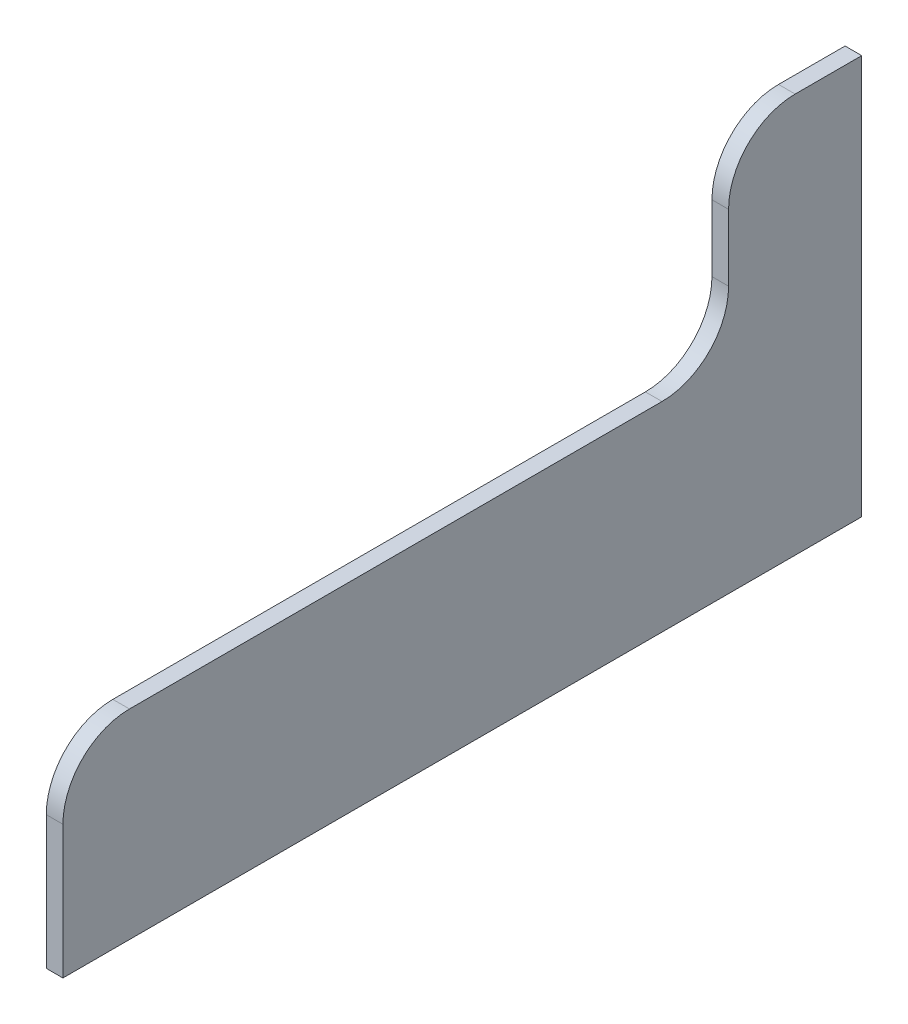
ISO-10303-21;
HEADER;
FILE_DESCRIPTION(('STEP AP214'),'2;1');
FILE_NAME('part.step','',(''),(''),'','','');
FILE_SCHEMA(('AUTOMOTIVE_DESIGN { 1 0 10303 214 1 1 1 1 }'));
ENDSEC;
DATA;
#1=APPLICATION_CONTEXT('core data for automotive mechanical design processes');
#2=APPLICATION_PROTOCOL_DEFINITION('international standard','automotive_design',2000,#1);
#3=PRODUCT_CONTEXT('',#1,'mechanical');
#4=PRODUCT('Part','Part','',(#3));
#5=PRODUCT_RELATED_PRODUCT_CATEGORY('part','',(#4));
#6=PRODUCT_DEFINITION_FORMATION('','',#4);
#7=PRODUCT_DEFINITION_CONTEXT('part definition',#1,'design');
#8=PRODUCT_DEFINITION('design','',#6,#7);
#9=PRODUCT_DEFINITION_SHAPE('','',#8);
#10=(LENGTH_UNIT() NAMED_UNIT(*) SI_UNIT(.MILLI.,.METRE.));
#11=(NAMED_UNIT(*) PLANE_ANGLE_UNIT() SI_UNIT($,.RADIAN.));
#12=(NAMED_UNIT(*) SI_UNIT($,.STERADIAN.) SOLID_ANGLE_UNIT());
#13=UNCERTAINTY_MEASURE_WITH_UNIT(LENGTH_MEASURE(1.E-05),#10,'distance_accuracy_value','');
#14=(GEOMETRIC_REPRESENTATION_CONTEXT(3) GLOBAL_UNCERTAINTY_ASSIGNED_CONTEXT((#13)) GLOBAL_UNIT_ASSIGNED_CONTEXT((#10,
#11,#12)) REPRESENTATION_CONTEXT('',''));
#15=CARTESIAN_POINT('',(0.,0.,0.));
#16=DIRECTION('',(0.,0.,1.));
#17=DIRECTION('',(1.,0.,0.));
#18=AXIS2_PLACEMENT_3D('',#15,#16,#17);
#19=CARTESIAN_POINT('',(12.7,0.,0.));
#20=DIRECTION('',(1.,0.,0.));
#21=DIRECTION('',(0.,0.,-1.));
#22=AXIS2_PLACEMENT_3D('',#19,#20,#21);
#23=PLANE('',#22);
#24=CARTESIAN_POINT('',(12.7,203.2,152.4));
#25=DIRECTION('',(1.,0.,0.));
#26=DIRECTION('',(0.,0.,-1.));
#27=AXIS2_PLACEMENT_3D('',#24,#25,#26);
#28=CIRCLE('',#27,50.8);
#29=CARTESIAN_POINT('',(12.7,203.2,101.6));
#30=VERTEX_POINT('',#29);
#31=CARTESIAN_POINT('',(12.7,152.4,152.4));
#32=VERTEX_POINT('',#31);
#33=EDGE_CURVE('E156',#30,#32,#28,.F.);
#34=ORIENTED_EDGE('',*,*,#33,.T.);
#35=DIRECTION('',(0.,0.,1.));
#36=VECTOR('',#35,1.);
#37=CARTESIAN_POINT('',(12.7,152.4,101.6));
#38=LINE('',#37,#36);
#39=CARTESIAN_POINT('',(12.7,152.4,558.8));
#40=VERTEX_POINT('',#39);
#41=EDGE_CURVE('E153',#40,#32,#38,.F.);
#42=ORIENTED_EDGE('',*,*,#41,.F.);
#43=CARTESIAN_POINT('',(12.7,101.6,558.8));
#44=DIRECTION('',(-1.,0.,0.));
#45=DIRECTION('',(0.,0.,1.));
#46=AXIS2_PLACEMENT_3D('',#43,#44,#45);
#47=CIRCLE('',#46,50.8);
#48=CARTESIAN_POINT('',(12.7,101.6,609.6));
#49=VERTEX_POINT('',#48);
#50=EDGE_CURVE('E179',#49,#40,#47,.T.);
#51=ORIENTED_EDGE('',*,*,#50,.F.);
#52=DIRECTION('',(0.,1.,0.));
#53=VECTOR('',#52,1.);
#54=CARTESIAN_POINT('',(12.7,152.4,609.6));
#55=LINE('',#54,#53);
#56=CARTESIAN_POINT('',(12.7,0.,609.6));
#57=VERTEX_POINT('',#56);
#58=EDGE_CURVE('E157',#57,#49,#55,.T.);
#59=ORIENTED_EDGE('',*,*,#58,.F.);
#60=DIRECTION('',(0.,0.,-1.));
#61=VECTOR('',#60,1.);
#62=CARTESIAN_POINT('',(12.7,0.,609.6));
#63=LINE('',#62,#61);
#64=CARTESIAN_POINT('',(12.7,0.,0.));
#65=VERTEX_POINT('',#64);
#66=EDGE_CURVE('E150',#65,#57,#63,.F.);
#67=ORIENTED_EDGE('',*,*,#66,.F.);
#68=DIRECTION('',(0.,1.,0.));
#69=VECTOR('',#68,1.);
#70=CARTESIAN_POINT('',(12.7,0.,0.));
#71=LINE('',#70,#69);
#72=CARTESIAN_POINT('',(12.7,304.8,0.));
#73=VERTEX_POINT('',#72);
#74=EDGE_CURVE('E144',#73,#65,#71,.F.);
#75=ORIENTED_EDGE('',*,*,#74,.F.);
#76=DIRECTION('',(0.,0.,1.));
#77=VECTOR('',#76,1.);
#78=CARTESIAN_POINT('',(12.7,304.8,0.));
#79=LINE('',#78,#77);
#80=CARTESIAN_POINT('',(12.7,304.8,50.8));
#81=VERTEX_POINT('',#80);
#82=EDGE_CURVE('E97',#81,#73,#79,.F.);
#83=ORIENTED_EDGE('',*,*,#82,.F.);
#84=CARTESIAN_POINT('',(12.7,254.,50.8));
#85=DIRECTION('',(-1.,0.,0.));
#86=DIRECTION('',(0.,0.,1.));
#87=AXIS2_PLACEMENT_3D('',#84,#85,#86);
#88=CIRCLE('',#87,50.8);
#89=CARTESIAN_POINT('',(12.7,254.,101.6));
#90=VERTEX_POINT('',#89);
#91=EDGE_CURVE('E36',#90,#81,#88,.T.);
#92=ORIENTED_EDGE('',*,*,#91,.F.);
#93=DIRECTION('',(0.,1.,0.));
#94=VECTOR('',#93,1.);
#95=CARTESIAN_POINT('',(12.7,304.8,101.6));
#96=LINE('',#95,#94);
#97=EDGE_CURVE('E161',#30,#90,#96,.T.);
#98=ORIENTED_EDGE('',*,*,#97,.F.);
#99=EDGE_LOOP('',(#34,#42,#51,#59,#67,#75,#83,#92,#98));
#100=FACE_BOUND('',#99,.T.);
#101=ADVANCED_FACE('F33',(#100),#23,.T.);
#102=CARTESIAN_POINT('',(0.,152.4,609.6));
#103=DIRECTION('',(0.,0.,1.));
#104=DIRECTION('',(1.,0.,0.));
#105=AXIS2_PLACEMENT_3D('',#102,#103,#104);
#106=PLANE('',#105);
#107=DIRECTION('',(1.,0.,0.));
#108=VECTOR('',#107,1.);
#109=CARTESIAN_POINT('',(0.,0.,609.6));
#110=LINE('',#109,#108);
#111=CARTESIAN_POINT('',(0.,0.,609.6));
#112=VERTEX_POINT('',#111);
#113=EDGE_CURVE('E109',#57,#112,#110,.F.);
#114=ORIENTED_EDGE('',*,*,#113,.F.);
#115=ORIENTED_EDGE('',*,*,#58,.T.);
#116=DIRECTION('',(-1.,0.,0.));
#117=VECTOR('',#116,1.);
#118=CARTESIAN_POINT('',(75.06716,101.6,609.6));
#119=LINE('',#118,#117);
#120=CARTESIAN_POINT('',(0.,101.6,609.6));
#121=VERTEX_POINT('',#120);
#122=EDGE_CURVE('E180',#121,#49,#119,.F.);
#123=ORIENTED_EDGE('',*,*,#122,.F.);
#124=DIRECTION('',(0.,1.,0.));
#125=VECTOR('',#124,1.);
#126=CARTESIAN_POINT('',(0.,0.,609.6));
#127=LINE('',#126,#125);
#128=EDGE_CURVE('E136',#121,#112,#127,.F.);
#129=ORIENTED_EDGE('',*,*,#128,.T.);
#130=EDGE_LOOP('',(#114,#115,#123,#129));
#131=FACE_BOUND('',#130,.T.);
#132=ADVANCED_FACE('F233',(#131),#106,.T.);
#133=CARTESIAN_POINT('',(0.,0.,609.6));
#134=DIRECTION('',(0.,-1.,0.));
#135=DIRECTION('',(0.,0.,-1.));
#136=AXIS2_PLACEMENT_3D('',#133,#134,#135);
#137=PLANE('',#136);
#138=ORIENTED_EDGE('',*,*,#66,.T.);
#139=ORIENTED_EDGE('',*,*,#113,.T.);
#140=DIRECTION('',(0.,0.,-1.));
#141=VECTOR('',#140,1.);
#142=CARTESIAN_POINT('',(0.,0.,0.));
#143=LINE('',#142,#141);
#144=CARTESIAN_POINT('',(0.,0.,0.));
#145=VERTEX_POINT('',#144);
#146=EDGE_CURVE('E134',#112,#145,#143,.T.);
#147=ORIENTED_EDGE('',*,*,#146,.T.);
#148=DIRECTION('',(-1.,0.,0.));
#149=VECTOR('',#148,1.);
#150=CARTESIAN_POINT('',(0.,0.,0.));
#151=LINE('',#150,#149);
#152=EDGE_CURVE('E115',#65,#145,#151,.T.);
#153=ORIENTED_EDGE('',*,*,#152,.F.);
#154=EDGE_LOOP('',(#138,#139,#147,#153));
#155=FACE_BOUND('',#154,.T.);
#156=ADVANCED_FACE('F237',(#155),#137,.T.);
#157=CARTESIAN_POINT('',(0.,0.,0.));
#158=DIRECTION('',(0.,0.,-1.));
#159=DIRECTION('',(-1.,0.,0.));
#160=AXIS2_PLACEMENT_3D('',#157,#158,#159);
#161=PLANE('',#160);
#162=ORIENTED_EDGE('',*,*,#74,.T.);
#163=ORIENTED_EDGE('',*,*,#152,.T.);
#164=DIRECTION('',(0.,1.,0.));
#165=VECTOR('',#164,1.);
#166=CARTESIAN_POINT('',(0.,0.,0.));
#167=LINE('',#166,#165);
#168=CARTESIAN_POINT('',(0.,304.8,0.));
#169=VERTEX_POINT('',#168);
#170=EDGE_CURVE('E128',#145,#169,#167,.T.);
#171=ORIENTED_EDGE('',*,*,#170,.T.);
#172=DIRECTION('',(1.,0.,0.));
#173=VECTOR('',#172,1.);
#174=CARTESIAN_POINT('',(0.,304.8,0.));
#175=LINE('',#174,#173);
#176=EDGE_CURVE('E119',#73,#169,#175,.F.);
#177=ORIENTED_EDGE('',*,*,#176,.F.);
#178=EDGE_LOOP('',(#162,#163,#171,#177));
#179=FACE_BOUND('',#178,.T.);
#180=ADVANCED_FACE('F133',(#179),#161,.T.);
#181=CARTESIAN_POINT('',(0.,304.8,0.));
#182=DIRECTION('',(0.,1.,0.));
#183=DIRECTION('',(0.,0.,1.));
#184=AXIS2_PLACEMENT_3D('',#181,#182,#183);
#185=PLANE('',#184);
#186=ORIENTED_EDGE('',*,*,#176,.T.);
#187=DIRECTION('',(0.,0.,-1.));
#188=VECTOR('',#187,1.);
#189=CARTESIAN_POINT('',(0.,304.8,0.));
#190=LINE('',#189,#188);
#191=CARTESIAN_POINT('',(0.,304.8,50.8));
#192=VERTEX_POINT('',#191);
#193=EDGE_CURVE('E122',#169,#192,#190,.F.);
#194=ORIENTED_EDGE('',*,*,#193,.T.);
#195=DIRECTION('',(-1.,0.,0.));
#196=VECTOR('',#195,1.);
#197=CARTESIAN_POINT('',(75.06716,304.8,50.8));
#198=LINE('',#197,#196);
#199=EDGE_CURVE('E193',#81,#192,#198,.T.);
#200=ORIENTED_EDGE('',*,*,#199,.F.);
#201=ORIENTED_EDGE('',*,*,#82,.T.);
#202=EDGE_LOOP('',(#186,#194,#200,#201));
#203=FACE_BOUND('',#202,.T.);
#204=ADVANCED_FACE('F121',(#203),#185,.T.);
#205=CARTESIAN_POINT('',(75.06716,254.,50.8));
#206=DIRECTION('',(-1.,0.,0.));
#207=DIRECTION('',(0.,0.,1.));
#208=AXIS2_PLACEMENT_3D('',#205,#206,#207);
#209=CYLINDRICAL_SURFACE('',#208,50.8);
#210=ORIENTED_EDGE('',*,*,#91,.T.);
#211=ORIENTED_EDGE('',*,*,#199,.T.);
#212=CARTESIAN_POINT('',(0.,254.,50.8));
#213=DIRECTION('',(-1.,0.,0.));
#214=DIRECTION('',(0.,0.,1.));
#215=AXIS2_PLACEMENT_3D('',#212,#213,#214);
#216=CIRCLE('',#215,50.8);
#217=CARTESIAN_POINT('',(0.,254.,101.6));
#218=VERTEX_POINT('',#217);
#219=EDGE_CURVE('E131',#192,#218,#216,.F.);
#220=ORIENTED_EDGE('',*,*,#219,.T.);
#221=DIRECTION('',(1.,0.,0.));
#222=VECTOR('',#221,1.);
#223=CARTESIAN_POINT('',(0.,254.,101.6));
#224=LINE('',#223,#222);
#225=EDGE_CURVE('E164',#90,#218,#224,.F.);
#226=ORIENTED_EDGE('',*,*,#225,.F.);
#227=EDGE_LOOP('',(#210,#211,#220,#226));
#228=FACE_BOUND('',#227,.T.);
#229=ADVANCED_FACE('F194',(#228),#209,.T.);
#230=CARTESIAN_POINT('',(0.,304.8,101.6));
#231=DIRECTION('',(0.,0.,1.));
#232=DIRECTION('',(1.,0.,0.));
#233=AXIS2_PLACEMENT_3D('',#230,#231,#232);
#234=PLANE('',#233);
#235=DIRECTION('',(1.,0.,0.));
#236=VECTOR('',#235,1.);
#237=CARTESIAN_POINT('',(-62.36716,203.2,101.6));
#238=LINE('',#237,#236);
#239=CARTESIAN_POINT('',(0.,203.2,101.6));
#240=VERTEX_POINT('',#239);
#241=EDGE_CURVE('E163',#240,#30,#238,.T.);
#242=ORIENTED_EDGE('',*,*,#241,.T.);
#243=ORIENTED_EDGE('',*,*,#97,.T.);
#244=ORIENTED_EDGE('',*,*,#225,.T.);
#245=DIRECTION('',(0.,1.,0.));
#246=VECTOR('',#245,1.);
#247=CARTESIAN_POINT('',(0.,0.,101.6));
#248=LINE('',#247,#246);
#249=EDGE_CURVE('E177',#218,#240,#248,.F.);
#250=ORIENTED_EDGE('',*,*,#249,.T.);
#251=EDGE_LOOP('',(#242,#243,#244,#250));
#252=FACE_BOUND('',#251,.T.);
#253=ADVANCED_FACE('F195',(#252),#234,.T.);
#254=CARTESIAN_POINT('',(-62.36716,203.2,152.4));
#255=DIRECTION('',(1.,0.,0.));
#256=DIRECTION('',(0.,0.,-1.));
#257=AXIS2_PLACEMENT_3D('',#254,#255,#256);
#258=CYLINDRICAL_SURFACE('',#257,50.8);
#259=ORIENTED_EDGE('',*,*,#33,.F.);
#260=ORIENTED_EDGE('',*,*,#241,.F.);
#261=CARTESIAN_POINT('',(0.,203.2,152.4));
#262=DIRECTION('',(1.,0.,0.));
#263=DIRECTION('',(0.,0.,-1.));
#264=AXIS2_PLACEMENT_3D('',#261,#262,#263);
#265=CIRCLE('',#264,50.8);
#266=CARTESIAN_POINT('',(0.,152.4,152.4));
#267=VERTEX_POINT('',#266);
#268=EDGE_CURVE('E174',#240,#267,#265,.F.);
#269=ORIENTED_EDGE('',*,*,#268,.T.);
#270=DIRECTION('',(1.,0.,0.));
#271=VECTOR('',#270,1.);
#272=CARTESIAN_POINT('',(0.,152.4,152.4));
#273=LINE('',#272,#271);
#274=EDGE_CURVE('E155',#32,#267,#273,.F.);
#275=ORIENTED_EDGE('',*,*,#274,.F.);
#276=EDGE_LOOP('',(#259,#260,#269,#275));
#277=FACE_BOUND('',#276,.T.);
#278=ADVANCED_FACE('F213',(#277),#258,.F.);
#279=CARTESIAN_POINT('',(0.,152.4,101.6));
#280=DIRECTION('',(0.,1.,0.));
#281=DIRECTION('',(0.,0.,1.));
#282=AXIS2_PLACEMENT_3D('',#279,#280,#281);
#283=PLANE('',#282);
#284=ORIENTED_EDGE('',*,*,#274,.T.);
#285=DIRECTION('',(0.,0.,-1.));
#286=VECTOR('',#285,1.);
#287=CARTESIAN_POINT('',(0.,152.4,0.));
#288=LINE('',#287,#286);
#289=CARTESIAN_POINT('',(0.,152.4,558.8));
#290=VERTEX_POINT('',#289);
#291=EDGE_CURVE('E42',#267,#290,#288,.F.);
#292=ORIENTED_EDGE('',*,*,#291,.T.);
#293=DIRECTION('',(-1.,0.,0.));
#294=VECTOR('',#293,1.);
#295=CARTESIAN_POINT('',(75.06716,152.4,558.8));
#296=LINE('',#295,#294);
#297=EDGE_CURVE('E50',#40,#290,#296,.T.);
#298=ORIENTED_EDGE('',*,*,#297,.F.);
#299=ORIENTED_EDGE('',*,*,#41,.T.);
#300=EDGE_LOOP('',(#284,#292,#298,#299));
#301=FACE_BOUND('',#300,.T.);
#302=ADVANCED_FACE('F211',(#301),#283,.T.);
#303=CARTESIAN_POINT('',(75.06716,101.6,558.8));
#304=DIRECTION('',(-1.,0.,0.));
#305=DIRECTION('',(0.,0.,1.));
#306=AXIS2_PLACEMENT_3D('',#303,#304,#305);
#307=CYLINDRICAL_SURFACE('',#306,50.8);
#308=ORIENTED_EDGE('',*,*,#50,.T.);
#309=ORIENTED_EDGE('',*,*,#297,.T.);
#310=CARTESIAN_POINT('',(0.,101.6,558.8));
#311=DIRECTION('',(-1.,0.,0.));
#312=DIRECTION('',(0.,0.,1.));
#313=AXIS2_PLACEMENT_3D('',#310,#311,#312);
#314=CIRCLE('',#313,50.8);
#315=EDGE_CURVE('E11',#290,#121,#314,.F.);
#316=ORIENTED_EDGE('',*,*,#315,.T.);
#317=ORIENTED_EDGE('',*,*,#122,.T.);
#318=EDGE_LOOP('',(#308,#309,#316,#317));
#319=FACE_BOUND('',#318,.T.);
#320=ADVANCED_FACE('F220',(#319),#307,.T.);
#321=CARTESIAN_POINT('',(0.,0.,0.));
#322=DIRECTION('',(1.,0.,0.));
#323=DIRECTION('',(0.,0.,-1.));
#324=AXIS2_PLACEMENT_3D('',#321,#322,#323);
#325=PLANE('',#324);
#326=ORIENTED_EDGE('',*,*,#291,.F.);
#327=ORIENTED_EDGE('',*,*,#268,.F.);
#328=ORIENTED_EDGE('',*,*,#249,.F.);
#329=ORIENTED_EDGE('',*,*,#219,.F.);
#330=ORIENTED_EDGE('',*,*,#193,.F.);
#331=ORIENTED_EDGE('',*,*,#170,.F.);
#332=ORIENTED_EDGE('',*,*,#146,.F.);
#333=ORIENTED_EDGE('',*,*,#128,.F.);
#334=ORIENTED_EDGE('',*,*,#315,.F.);
#335=EDGE_LOOP('',(#326,#327,#328,#329,#330,#331,#332,#333,#334));
#336=FACE_BOUND('',#335,.T.);
#337=ADVANCED_FACE('F127',(#336),#325,.F.);
#338=CLOSED_SHELL('',(#101,#132,#156,#180,#204,#229,#253,#278,#302,#320,#337));
#339=MANIFOLD_SOLID_BREP('B2',#338);
#340=ADVANCED_BREP_SHAPE_REPRESENTATION('',(#18,#339),#14);
#341=SHAPE_DEFINITION_REPRESENTATION(#9,#340);
ENDSEC;
END-ISO-10303-21;
